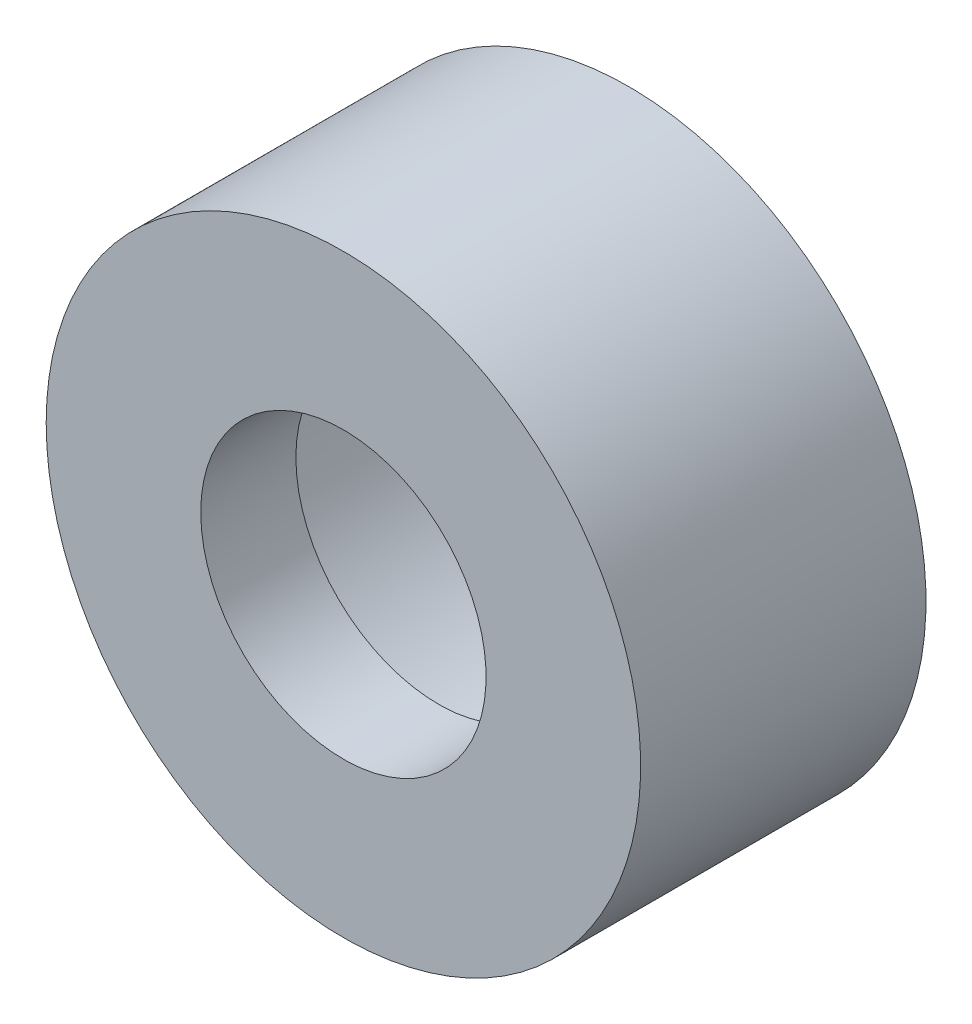
ISO-10303-21;
HEADER;
FILE_DESCRIPTION(('STEP AP214'),'2;1');
FILE_NAME('part.step','',(''),(''),'','','');
FILE_SCHEMA(('AUTOMOTIVE_DESIGN { 1 0 10303 214 1 1 1 1 }'));
ENDSEC;
DATA;
#1=APPLICATION_CONTEXT('core data for automotive mechanical design processes');
#2=APPLICATION_PROTOCOL_DEFINITION('international standard','automotive_design',2000,#1);
#3=PRODUCT_CONTEXT('',#1,'mechanical');
#4=PRODUCT('Part','Part','',(#3));
#5=PRODUCT_RELATED_PRODUCT_CATEGORY('part','',(#4));
#6=PRODUCT_DEFINITION_FORMATION('','',#4);
#7=PRODUCT_DEFINITION_CONTEXT('part definition',#1,'design');
#8=PRODUCT_DEFINITION('design','',#6,#7);
#9=PRODUCT_DEFINITION_SHAPE('','',#8);
#10=(LENGTH_UNIT() NAMED_UNIT(*) SI_UNIT(.MILLI.,.METRE.));
#11=(NAMED_UNIT(*) PLANE_ANGLE_UNIT() SI_UNIT($,.RADIAN.));
#12=(NAMED_UNIT(*) SI_UNIT($,.STERADIAN.) SOLID_ANGLE_UNIT());
#13=UNCERTAINTY_MEASURE_WITH_UNIT(LENGTH_MEASURE(1.E-05),#10,'distance_accuracy_value','');
#14=(GEOMETRIC_REPRESENTATION_CONTEXT(3) GLOBAL_UNCERTAINTY_ASSIGNED_CONTEXT((#13)) GLOBAL_UNIT_ASSIGNED_CONTEXT((#10,
#11,#12)) REPRESENTATION_CONTEXT('',''));
#15=CARTESIAN_POINT('',(0.,0.,0.));
#16=DIRECTION('',(0.,0.,1.));
#17=DIRECTION('',(1.,0.,0.));
#18=AXIS2_PLACEMENT_3D('',#15,#16,#17);
#19=CARTESIAN_POINT('',(0.,8.,10.));
#20=DIRECTION('',(0.,0.,-1.));
#21=DIRECTION('',(-1.,0.,0.));
#22=AXIS2_PLACEMENT_3D('',#19,#20,#21);
#23=PLANE('',#22);
#24=CARTESIAN_POINT('',(0.,0.,10.));
#25=DIRECTION('',(0.,0.,-1.));
#26=DIRECTION('',(-1.,0.,0.));
#27=AXIS2_PLACEMENT_3D('',#24,#25,#26);
#28=CIRCLE('',#27,6.);
#29=CARTESIAN_POINT('',(-6.,0.,10.));
#30=VERTEX_POINT('',#29);
#31=EDGE_CURVE('E33',#30,#30,#28,.F.);
#32=ORIENTED_EDGE('',*,*,#31,.T.);
#33=EDGE_LOOP('',(#32));
#34=FACE_BOUND('',#33,.T.);
#35=CARTESIAN_POINT('',(0.,0.,10.));
#36=DIRECTION('',(0.,0.,-1.));
#37=DIRECTION('',(-1.,0.,0.));
#38=AXIS2_PLACEMENT_3D('',#35,#36,#37);
#39=CIRCLE('',#38,10.);
#40=CARTESIAN_POINT('',(-10.,0.,10.));
#41=VERTEX_POINT('',#40);
#42=EDGE_CURVE('E17',#41,#41,#39,.T.);
#43=ORIENTED_EDGE('',*,*,#42,.T.);
#44=EDGE_LOOP('',(#43));
#45=FACE_BOUND('',#44,.T.);
#46=ADVANCED_FACE('F14',(#34,#45),#23,.T.);
#47=CARTESIAN_POINT('',(0.,0.,6.00000000000002));
#48=DIRECTION('',(0.,0.,-1.));
#49=DIRECTION('',(-1.,0.,0.));
#50=AXIS2_PLACEMENT_3D('',#47,#48,#49);
#51=CYLINDRICAL_SURFACE('',#50,10.);
#52=CARTESIAN_POINT('',(0.,0.,2.00000000000002));
#53=DIRECTION('',(0.,0.,-1.));
#54=DIRECTION('',(-1.,0.,0.));
#55=AXIS2_PLACEMENT_3D('',#52,#53,#54);
#56=CIRCLE('',#55,10.);
#57=CARTESIAN_POINT('',(-10.,0.,2.00000000000002));
#58=VERTEX_POINT('',#57);
#59=EDGE_CURVE('E31',#58,#58,#56,.F.);
#60=ORIENTED_EDGE('',*,*,#59,.F.);
#61=EDGE_LOOP('',(#60));
#62=FACE_BOUND('',#61,.T.);
#63=ORIENTED_EDGE('',*,*,#42,.F.);
#64=EDGE_LOOP('',(#63));
#65=FACE_BOUND('',#64,.T.);
#66=ADVANCED_FACE('F41',(#62,#65),#51,.F.);
#67=CARTESIAN_POINT('',(0.,0.,12.));
#68=DIRECTION('',(0.,0.,-1.));
#69=DIRECTION('',(-1.,0.,0.));
#70=AXIS2_PLACEMENT_3D('',#67,#68,#69);
#71=CYLINDRICAL_SURFACE('',#70,6.);
#72=ORIENTED_EDGE('',*,*,#31,.F.);
#73=EDGE_LOOP('',(#72));
#74=FACE_BOUND('',#73,.T.);
#75=CARTESIAN_POINT('',(0.,0.,14.));
#76=DIRECTION('',(0.,0.,-1.));
#77=DIRECTION('',(-1.,0.,0.));
#78=AXIS2_PLACEMENT_3D('',#75,#76,#77);
#79=CIRCLE('',#78,6.);
#80=CARTESIAN_POINT('',(-6.,0.,14.));
#81=VERTEX_POINT('',#80);
#82=EDGE_CURVE('E26',#81,#81,#79,.T.);
#83=ORIENTED_EDGE('',*,*,#82,.F.);
#84=EDGE_LOOP('',(#83));
#85=FACE_BOUND('',#84,.T.);
#86=ADVANCED_FACE('F43',(#74,#85),#71,.F.);
#87=CARTESIAN_POINT('',(0.,11.25,2.00000000000002));
#88=DIRECTION('',(0.,0.,-1.));
#89=DIRECTION('',(-1.,0.,0.));
#90=AXIS2_PLACEMENT_3D('',#87,#88,#89);
#91=PLANE('',#90);
#92=ORIENTED_EDGE('',*,*,#59,.T.);
#93=EDGE_LOOP('',(#92));
#94=FACE_BOUND('',#93,.T.);
#95=CARTESIAN_POINT('',(0.,0.,2.00000000000002));
#96=DIRECTION('',(0.,0.,-1.));
#97=DIRECTION('',(-1.,0.,0.));
#98=AXIS2_PLACEMENT_3D('',#95,#96,#97);
#99=CIRCLE('',#98,12.5);
#100=CARTESIAN_POINT('',(-12.5,0.,2.00000000000002));
#101=VERTEX_POINT('',#100);
#102=EDGE_CURVE('E21',#101,#101,#99,.F.);
#103=ORIENTED_EDGE('',*,*,#102,.F.);
#104=EDGE_LOOP('',(#103));
#105=FACE_BOUND('',#104,.T.);
#106=ADVANCED_FACE('F50',(#94,#105),#91,.T.);
#107=CARTESIAN_POINT('',(0.,9.25,14.));
#108=DIRECTION('',(0.,0.,1.));
#109=DIRECTION('',(1.,0.,0.));
#110=AXIS2_PLACEMENT_3D('',#107,#108,#109);
#111=PLANE('',#110);
#112=ORIENTED_EDGE('',*,*,#82,.T.);
#113=EDGE_LOOP('',(#112));
#114=FACE_BOUND('',#113,.T.);
#115=CARTESIAN_POINT('',(0.,0.,14.));
#116=DIRECTION('',(0.,0.,-1.));
#117=DIRECTION('',(-1.,0.,0.));
#118=AXIS2_PLACEMENT_3D('',#115,#116,#117);
#119=CIRCLE('',#118,12.5);
#120=CARTESIAN_POINT('',(-12.5,0.,14.));
#121=VERTEX_POINT('',#120);
#122=EDGE_CURVE('E10',#121,#121,#119,.T.);
#123=ORIENTED_EDGE('',*,*,#122,.F.);
#124=EDGE_LOOP('',(#123));
#125=FACE_BOUND('',#124,.T.);
#126=ADVANCED_FACE('F56',(#114,#125),#111,.T.);
#127=CARTESIAN_POINT('',(0.,0.,8.00000000000002));
#128=DIRECTION('',(0.,0.,-1.));
#129=DIRECTION('',(-1.,0.,0.));
#130=AXIS2_PLACEMENT_3D('',#127,#128,#129);
#131=CYLINDRICAL_SURFACE('',#130,12.5);
#132=ORIENTED_EDGE('',*,*,#122,.T.);
#133=EDGE_LOOP('',(#132));
#134=FACE_BOUND('',#133,.T.);
#135=ORIENTED_EDGE('',*,*,#102,.T.);
#136=EDGE_LOOP('',(#135));
#137=FACE_BOUND('',#136,.T.);
#138=ADVANCED_FACE('F54',(#134,#137),#131,.T.);
#139=CLOSED_SHELL('',(#46,#66,#86,#106,#126,#138));
#140=MANIFOLD_SOLID_BREP('B1',#139);
#141=ADVANCED_BREP_SHAPE_REPRESENTATION('',(#18,#140),#14);
#142=SHAPE_DEFINITION_REPRESENTATION(#9,#141);
ENDSEC;
END-ISO-10303-21;
